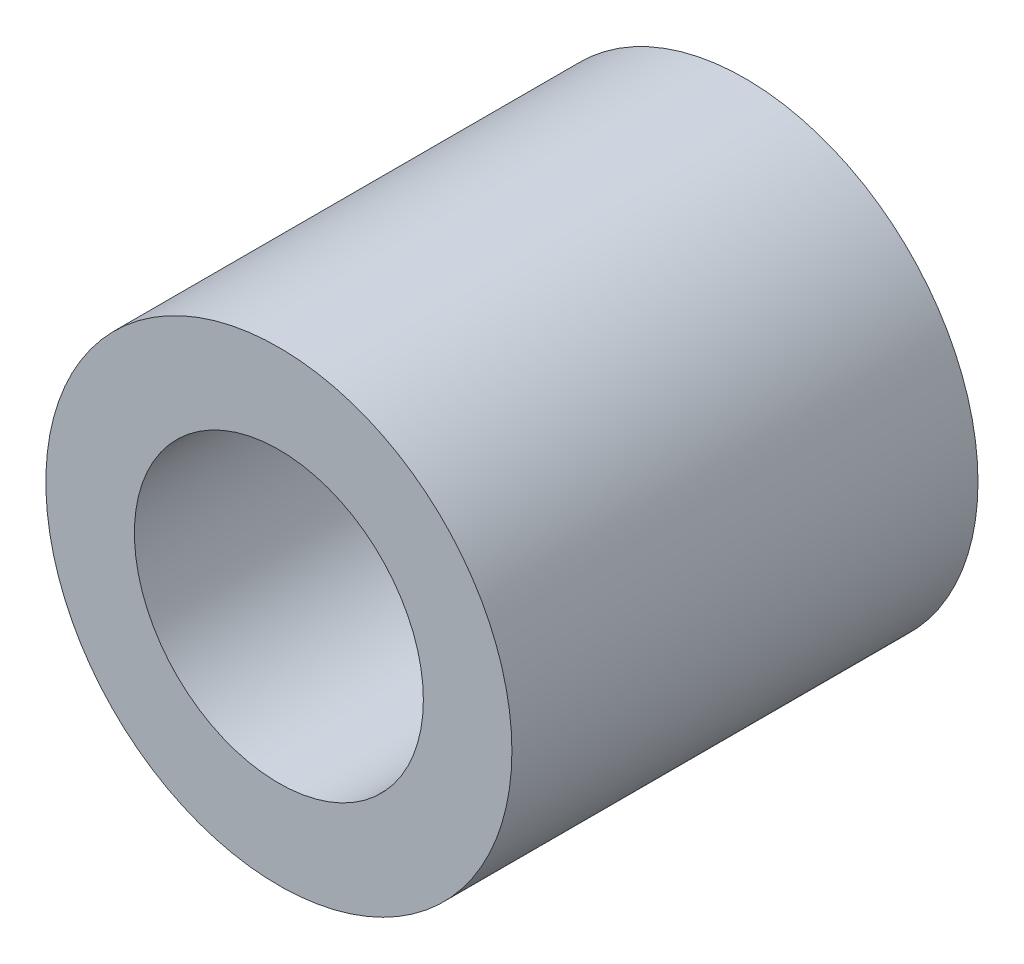
ISO-10303-21;
HEADER;
FILE_DESCRIPTION(('STEP AP214'),'2;1');
FILE_NAME('part.step','',(''),(''),'','','');
FILE_SCHEMA(('AUTOMOTIVE_DESIGN { 1 0 10303 214 1 1 1 1 }'));
ENDSEC;
DATA;
#1=APPLICATION_CONTEXT('core data for automotive mechanical design processes');
#2=APPLICATION_PROTOCOL_DEFINITION('international standard','automotive_design',2000,#1);
#3=PRODUCT_CONTEXT('',#1,'mechanical');
#4=PRODUCT('Part','Part','',(#3));
#5=PRODUCT_RELATED_PRODUCT_CATEGORY('part','',(#4));
#6=PRODUCT_DEFINITION_FORMATION('','',#4);
#7=PRODUCT_DEFINITION_CONTEXT('part definition',#1,'design');
#8=PRODUCT_DEFINITION('design','',#6,#7);
#9=PRODUCT_DEFINITION_SHAPE('','',#8);
#10=(LENGTH_UNIT() NAMED_UNIT(*) SI_UNIT(.MILLI.,.METRE.));
#11=(NAMED_UNIT(*) PLANE_ANGLE_UNIT() SI_UNIT($,.RADIAN.));
#12=(NAMED_UNIT(*) SI_UNIT($,.STERADIAN.) SOLID_ANGLE_UNIT());
#13=UNCERTAINTY_MEASURE_WITH_UNIT(LENGTH_MEASURE(1.E-05),#10,'distance_accuracy_value','');
#14=(GEOMETRIC_REPRESENTATION_CONTEXT(3) GLOBAL_UNCERTAINTY_ASSIGNED_CONTEXT((#13)) GLOBAL_UNIT_ASSIGNED_CONTEXT((#10,
#11,#12)) REPRESENTATION_CONTEXT('',''));
#15=CARTESIAN_POINT('',(0.,0.,0.));
#16=DIRECTION('',(0.,0.,1.));
#17=DIRECTION('',(1.,0.,0.));
#18=AXIS2_PLACEMENT_3D('',#15,#16,#17);
#19=CARTESIAN_POINT('',(0.,0.,5.));
#20=DIRECTION('',(0.,0.,1.));
#21=DIRECTION('',(1.,0.,0.));
#22=AXIS2_PLACEMENT_3D('',#19,#20,#21);
#23=PLANE('',#22);
#24=CARTESIAN_POINT('',(0.,0.,5.));
#25=DIRECTION('',(0.,0.,1.));
#26=DIRECTION('',(1.,0.,0.));
#27=AXIS2_PLACEMENT_3D('',#24,#25,#26);
#28=CIRCLE('',#27,2.5);
#29=CARTESIAN_POINT('',(2.5,0.,5.));
#30=VERTEX_POINT('',#29);
#31=EDGE_CURVE('E10',#30,#30,#28,.T.);
#32=ORIENTED_EDGE('',*,*,#31,.T.);
#33=EDGE_LOOP('',(#32));
#34=FACE_BOUND('',#33,.T.);
#35=CARTESIAN_POINT('',(0.,0.,5.));
#36=DIRECTION('',(0.,0.,1.));
#37=DIRECTION('',(1.,0.,0.));
#38=AXIS2_PLACEMENT_3D('',#35,#36,#37);
#39=CIRCLE('',#38,1.55);
#40=CARTESIAN_POINT('',(1.55,0.,5.));
#41=VERTEX_POINT('',#40);
#42=EDGE_CURVE('E45',#41,#41,#39,.T.);
#43=ORIENTED_EDGE('',*,*,#42,.F.);
#44=EDGE_LOOP('',(#43));
#45=FACE_BOUND('',#44,.T.);
#46=ADVANCED_FACE('F34',(#34,#45),#23,.T.);
#47=CARTESIAN_POINT('',(0.,0.,0.));
#48=DIRECTION('',(0.,0.,1.));
#49=DIRECTION('',(1.,0.,0.));
#50=AXIS2_PLACEMENT_3D('',#47,#48,#49);
#51=PLANE('',#50);
#52=CARTESIAN_POINT('',(0.,0.,0.));
#53=DIRECTION('',(0.,0.,1.));
#54=DIRECTION('',(1.,0.,0.));
#55=AXIS2_PLACEMENT_3D('',#52,#53,#54);
#56=CIRCLE('',#55,2.5);
#57=CARTESIAN_POINT('',(2.5,0.,0.));
#58=VERTEX_POINT('',#57);
#59=EDGE_CURVE('E38',#58,#58,#56,.T.);
#60=ORIENTED_EDGE('',*,*,#59,.F.);
#61=EDGE_LOOP('',(#60));
#62=FACE_BOUND('',#61,.T.);
#63=CARTESIAN_POINT('',(0.,0.,0.));
#64=DIRECTION('',(0.,0.,1.));
#65=DIRECTION('',(1.,0.,0.));
#66=AXIS2_PLACEMENT_3D('',#63,#64,#65);
#67=CIRCLE('',#66,1.55);
#68=CARTESIAN_POINT('',(1.55,0.,0.));
#69=VERTEX_POINT('',#68);
#70=EDGE_CURVE('E47',#69,#69,#67,.T.);
#71=ORIENTED_EDGE('',*,*,#70,.T.);
#72=EDGE_LOOP('',(#71));
#73=FACE_BOUND('',#72,.T.);
#74=ADVANCED_FACE('F57',(#62,#73),#51,.F.);
#75=CARTESIAN_POINT('',(0.,0.,5.));
#76=DIRECTION('',(0.,0.,-1.));
#77=DIRECTION('',(-1.,0.,0.));
#78=AXIS2_PLACEMENT_3D('',#75,#76,#77);
#79=CYLINDRICAL_SURFACE('',#78,2.5);
#80=ORIENTED_EDGE('',*,*,#31,.F.);
#81=EDGE_LOOP('',(#80));
#82=FACE_BOUND('',#81,.T.);
#83=ORIENTED_EDGE('',*,*,#59,.T.);
#84=EDGE_LOOP('',(#83));
#85=FACE_BOUND('',#84,.T.);
#86=ADVANCED_FACE('F36',(#82,#85),#79,.T.);
#87=CARTESIAN_POINT('',(0.,0.,5.));
#88=DIRECTION('',(0.,0.,-1.));
#89=DIRECTION('',(-1.,0.,0.));
#90=AXIS2_PLACEMENT_3D('',#87,#88,#89);
#91=CYLINDRICAL_SURFACE('',#90,1.55);
#92=ORIENTED_EDGE('',*,*,#42,.T.);
#93=EDGE_LOOP('',(#92));
#94=FACE_BOUND('',#93,.T.);
#95=ORIENTED_EDGE('',*,*,#70,.F.);
#96=EDGE_LOOP('',(#95));
#97=FACE_BOUND('',#96,.T.);
#98=ADVANCED_FACE('F53',(#94,#97),#91,.F.);
#99=CLOSED_SHELL('',(#46,#74,#86,#98));
#100=MANIFOLD_SOLID_BREP('B2',#99);
#101=ADVANCED_BREP_SHAPE_REPRESENTATION('',(#18,#100),#14);
#102=SHAPE_DEFINITION_REPRESENTATION(#9,#101);
ENDSEC;
END-ISO-10303-21;
